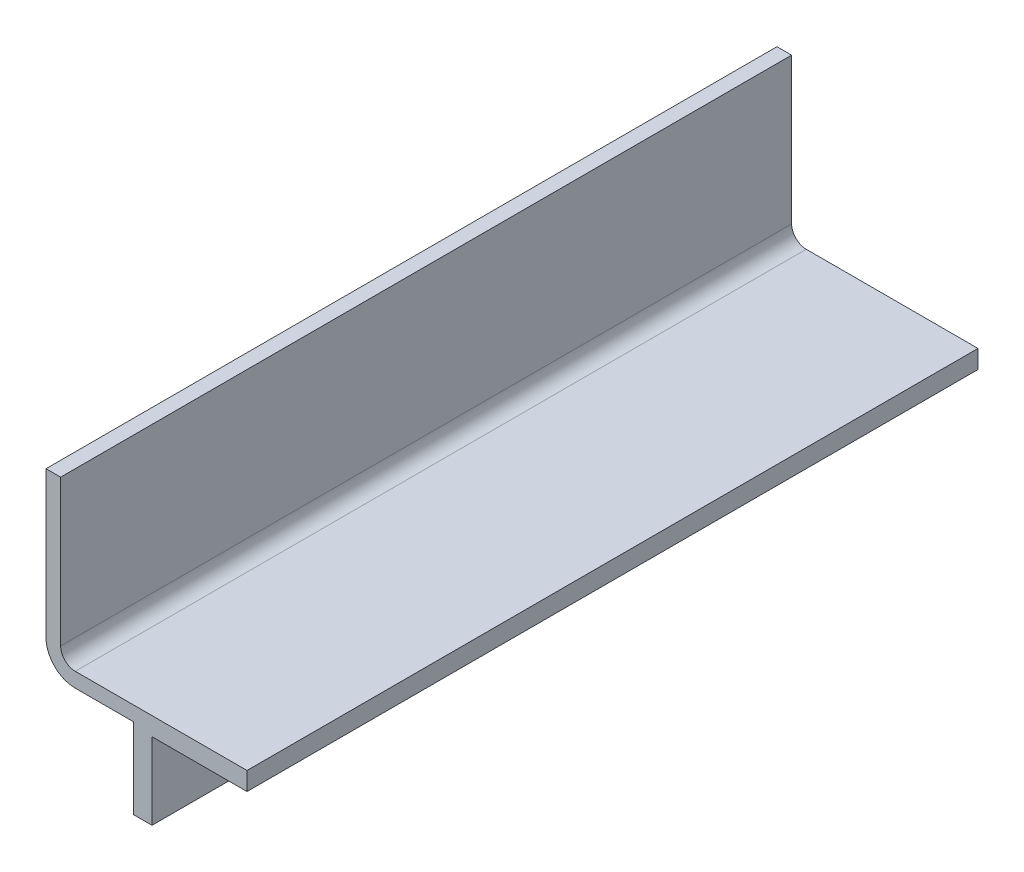
ISO-10303-21;
HEADER;
FILE_DESCRIPTION(('STEP AP214'),'2;1');
FILE_NAME('part.step','',(''),(''),'','','');
FILE_SCHEMA(('AUTOMOTIVE_DESIGN { 1 0 10303 214 1 1 1 1 }'));
ENDSEC;
DATA;
#1=APPLICATION_CONTEXT('core data for automotive mechanical design processes');
#2=APPLICATION_PROTOCOL_DEFINITION('international standard','automotive_design',2000,#1);
#3=PRODUCT_CONTEXT('',#1,'mechanical');
#4=PRODUCT('Part','Part','',(#3));
#5=PRODUCT_RELATED_PRODUCT_CATEGORY('part','',(#4));
#6=PRODUCT_DEFINITION_FORMATION('','',#4);
#7=PRODUCT_DEFINITION_CONTEXT('part definition',#1,'design');
#8=PRODUCT_DEFINITION('design','',#6,#7);
#9=PRODUCT_DEFINITION_SHAPE('','',#8);
#10=(LENGTH_UNIT() NAMED_UNIT(*) SI_UNIT(.MILLI.,.METRE.));
#11=(NAMED_UNIT(*) PLANE_ANGLE_UNIT() SI_UNIT($,.RADIAN.));
#12=(NAMED_UNIT(*) SI_UNIT($,.STERADIAN.) SOLID_ANGLE_UNIT());
#13=UNCERTAINTY_MEASURE_WITH_UNIT(LENGTH_MEASURE(1.E-05),#10,'distance_accuracy_value','');
#14=(GEOMETRIC_REPRESENTATION_CONTEXT(3) GLOBAL_UNCERTAINTY_ASSIGNED_CONTEXT((#13)) GLOBAL_UNIT_ASSIGNED_CONTEXT((#10,
#11,#12)) REPRESENTATION_CONTEXT('',''));
#15=CARTESIAN_POINT('',(0.,0.,0.));
#16=DIRECTION('',(0.,0.,1.));
#17=DIRECTION('',(1.,0.,0.));
#18=AXIS2_PLACEMENT_3D('',#15,#16,#17);
#19=CARTESIAN_POINT('',(-2.5,11.,100.));
#20=DIRECTION('',(1.,0.,0.));
#21=DIRECTION('',(0.,1.,0.));
#22=AXIS2_PLACEMENT_3D('',#19,#20,#21);
#23=PLANE('',#22);
#24=CARTESIAN_POINT('',(-2.5,4.5,15.));
#25=DIRECTION('',(-1.,0.,0.));
#26=DIRECTION('',(0.,0.,1.));
#27=AXIS2_PLACEMENT_3D('',#24,#25,#26);
#28=CIRCLE('',#27,2.24999999999999);
#29=CARTESIAN_POINT('',(-2.5,4.5,17.25));
#30=VERTEX_POINT('',#29);
#31=EDGE_CURVE('E265',#30,#30,#28,.T.);
#32=ORIENTED_EDGE('',*,*,#31,.F.);
#33=EDGE_LOOP('',(#32));
#34=FACE_BOUND('',#33,.T.);
#35=CARTESIAN_POINT('',(-2.5,4.5,85.));
#36=DIRECTION('',(-1.,0.,0.));
#37=DIRECTION('',(0.,0.,1.));
#38=AXIS2_PLACEMENT_3D('',#35,#36,#37);
#39=CIRCLE('',#38,2.24999999999999);
#40=CARTESIAN_POINT('',(-2.5,4.5,87.25));
#41=VERTEX_POINT('',#40);
#42=EDGE_CURVE('E268',#41,#41,#39,.T.);
#43=ORIENTED_EDGE('',*,*,#42,.F.);
#44=EDGE_LOOP('',(#43));
#45=FACE_BOUND('',#44,.T.);
#46=DIRECTION('',(0.,-1.,0.));
#47=VECTOR('',#46,1.);
#48=CARTESIAN_POINT('',(-2.5,11.,0.));
#49=LINE('',#48,#47);
#50=CARTESIAN_POINT('',(-2.5,11.,0.));
#51=VERTEX_POINT('',#50);
#52=CARTESIAN_POINT('',(-2.5,0.,0.));
#53=VERTEX_POINT('',#52);
#54=EDGE_CURVE('E156',#51,#53,#49,.T.);
#55=ORIENTED_EDGE('',*,*,#54,.T.);
#56=DIRECTION('',(0.,0.,-1.));
#57=VECTOR('',#56,1.);
#58=CARTESIAN_POINT('',(-2.5,0.,100.));
#59=LINE('',#58,#57);
#60=CARTESIAN_POINT('',(-2.5,0.,100.));
#61=VERTEX_POINT('',#60);
#62=EDGE_CURVE('E11',#61,#53,#59,.T.);
#63=ORIENTED_EDGE('',*,*,#62,.F.);
#64=DIRECTION('',(0.,-1.,0.));
#65=VECTOR('',#64,1.);
#66=CARTESIAN_POINT('',(-2.5,11.,100.));
#67=LINE('',#66,#65);
#68=CARTESIAN_POINT('',(-2.5,11.,100.));
#69=VERTEX_POINT('',#68);
#70=EDGE_CURVE('E179',#69,#61,#67,.T.);
#71=ORIENTED_EDGE('',*,*,#70,.F.);
#72=DIRECTION('',(0.,0.,-1.));
#73=VECTOR('',#72,1.);
#74=CARTESIAN_POINT('',(-2.5,11.,100.));
#75=LINE('',#74,#73);
#76=EDGE_CURVE('E152',#69,#51,#75,.T.);
#77=ORIENTED_EDGE('',*,*,#76,.T.);
#78=EDGE_LOOP('',(#55,#63,#71,#77));
#79=FACE_BOUND('',#78,.T.);
#80=ADVANCED_FACE('F36',(#34,#45,#79),#23,.F.);
#81=CARTESIAN_POINT('',(-2.5,0.,100.));
#82=DIRECTION('',(0.,1.,0.));
#83=DIRECTION('',(0.,0.,1.));
#84=AXIS2_PLACEMENT_3D('',#81,#82,#83);
#85=PLANE('',#84);
#86=DIRECTION('',(1.,0.,0.));
#87=VECTOR('',#86,1.);
#88=CARTESIAN_POINT('',(-2.5,0.,0.));
#89=LINE('',#88,#87);
#90=CARTESIAN_POINT('',(0.,0.,0.));
#91=VERTEX_POINT('',#90);
#92=EDGE_CURVE('E159',#53,#91,#89,.T.);
#93=ORIENTED_EDGE('',*,*,#92,.T.);
#94=DIRECTION('',(0.,0.,-1.));
#95=VECTOR('',#94,1.);
#96=CARTESIAN_POINT('',(0.,0.,100.));
#97=LINE('',#96,#95);
#98=CARTESIAN_POINT('',(0.,0.,100.));
#99=VERTEX_POINT('',#98);
#100=EDGE_CURVE('E44',#99,#91,#97,.T.);
#101=ORIENTED_EDGE('',*,*,#100,.F.);
#102=DIRECTION('',(1.,0.,0.));
#103=VECTOR('',#102,1.);
#104=CARTESIAN_POINT('',(-2.5,0.,100.));
#105=LINE('',#104,#103);
#106=EDGE_CURVE('E107',#61,#99,#105,.T.);
#107=ORIENTED_EDGE('',*,*,#106,.F.);
#108=ORIENTED_EDGE('',*,*,#62,.T.);
#109=EDGE_LOOP('',(#93,#101,#107,#108));
#110=FACE_BOUND('',#109,.T.);
#111=ADVANCED_FACE('F257',(#110),#85,.F.);
#112=CARTESIAN_POINT('',(0.,0.,100.));
#113=DIRECTION('',(-1.,0.,0.));
#114=DIRECTION('',(0.,0.,1.));
#115=AXIS2_PLACEMENT_3D('',#112,#113,#114);
#116=PLANE('',#115);
#117=CARTESIAN_POINT('',(0.,4.5,15.));
#118=DIRECTION('',(-1.,0.,0.));
#119=DIRECTION('',(0.,0.,1.));
#120=AXIS2_PLACEMENT_3D('',#117,#118,#119);
#121=CIRCLE('',#120,2.24999999999999);
#122=CARTESIAN_POINT('',(0.,4.5,17.25));
#123=VERTEX_POINT('',#122);
#124=EDGE_CURVE('E270',#123,#123,#121,.T.);
#125=ORIENTED_EDGE('',*,*,#124,.T.);
#126=EDGE_LOOP('',(#125));
#127=FACE_BOUND('',#126,.T.);
#128=CARTESIAN_POINT('',(0.,4.5,85.));
#129=DIRECTION('',(-1.,0.,0.));
#130=DIRECTION('',(0.,0.,1.));
#131=AXIS2_PLACEMENT_3D('',#128,#129,#130);
#132=CIRCLE('',#131,2.24999999999999);
#133=CARTESIAN_POINT('',(0.,4.5,87.25));
#134=VERTEX_POINT('',#133);
#135=EDGE_CURVE('E160',#134,#134,#132,.T.);
#136=ORIENTED_EDGE('',*,*,#135,.T.);
#137=EDGE_LOOP('',(#136));
#138=FACE_BOUND('',#137,.T.);
#139=DIRECTION('',(0.,1.,0.));
#140=VECTOR('',#139,1.);
#141=CARTESIAN_POINT('',(0.,0.,0.));
#142=LINE('',#141,#140);
#143=CARTESIAN_POINT('',(0.,10.5,0.));
#144=VERTEX_POINT('',#143);
#145=EDGE_CURVE('E162',#91,#144,#142,.T.);
#146=ORIENTED_EDGE('',*,*,#145,.T.);
#147=DIRECTION('',(0.,0.,-1.));
#148=VECTOR('',#147,1.);
#149=CARTESIAN_POINT('',(0.,10.5,100.));
#150=LINE('',#149,#148);
#151=CARTESIAN_POINT('',(0.,10.5,100.));
#152=VERTEX_POINT('',#151);
#153=EDGE_CURVE('E198',#152,#144,#150,.T.);
#154=ORIENTED_EDGE('',*,*,#153,.F.);
#155=DIRECTION('',(0.,1.,0.));
#156=VECTOR('',#155,1.);
#157=CARTESIAN_POINT('',(0.,0.,100.));
#158=LINE('',#157,#156);
#159=EDGE_CURVE('E206',#99,#152,#158,.T.);
#160=ORIENTED_EDGE('',*,*,#159,.F.);
#161=ORIENTED_EDGE('',*,*,#100,.T.);
#162=EDGE_LOOP('',(#146,#154,#160,#161));
#163=FACE_BOUND('',#162,.T.);
#164=ADVANCED_FACE('F204',(#127,#138,#163),#116,.F.);
#165=CARTESIAN_POINT('',(0.,10.5,100.));
#166=DIRECTION('',(0.,1.,0.));
#167=DIRECTION('',(0.,0.,1.));
#168=AXIS2_PLACEMENT_3D('',#165,#166,#167);
#169=PLANE('',#168);
#170=DIRECTION('',(1.,0.,0.));
#171=VECTOR('',#170,1.);
#172=CARTESIAN_POINT('',(0.,10.5,0.));
#173=LINE('',#172,#171);
#174=CARTESIAN_POINT('',(13.,10.5,0.));
#175=VERTEX_POINT('',#174);
#176=EDGE_CURVE('E164',#144,#175,#173,.T.);
#177=ORIENTED_EDGE('',*,*,#176,.T.);
#178=DIRECTION('',(0.,0.,-1.));
#179=VECTOR('',#178,1.);
#180=CARTESIAN_POINT('',(13.,10.5,100.));
#181=LINE('',#180,#179);
#182=CARTESIAN_POINT('',(13.,10.5,100.));
#183=VERTEX_POINT('',#182);
#184=EDGE_CURVE('E195',#183,#175,#181,.T.);
#185=ORIENTED_EDGE('',*,*,#184,.F.);
#186=DIRECTION('',(1.,0.,0.));
#187=VECTOR('',#186,1.);
#188=CARTESIAN_POINT('',(0.,10.5,100.));
#189=LINE('',#188,#187);
#190=EDGE_CURVE('E224',#152,#183,#189,.T.);
#191=ORIENTED_EDGE('',*,*,#190,.F.);
#192=ORIENTED_EDGE('',*,*,#153,.T.);
#193=EDGE_LOOP('',(#177,#185,#191,#192));
#194=FACE_BOUND('',#193,.T.);
#195=ADVANCED_FACE('F215',(#194),#169,.F.);
#196=CARTESIAN_POINT('',(13.,10.5,100.));
#197=DIRECTION('',(-1.,0.,0.));
#198=DIRECTION('',(0.,0.,1.));
#199=AXIS2_PLACEMENT_3D('',#196,#197,#198);
#200=PLANE('',#199);
#201=DIRECTION('',(0.,1.,0.));
#202=VECTOR('',#201,1.);
#203=CARTESIAN_POINT('',(13.,10.5,0.));
#204=LINE('',#203,#202);
#205=CARTESIAN_POINT('',(13.,13.,0.));
#206=VERTEX_POINT('',#205);
#207=EDGE_CURVE('E166',#175,#206,#204,.T.);
#208=ORIENTED_EDGE('',*,*,#207,.T.);
#209=DIRECTION('',(0.,0.,-1.));
#210=VECTOR('',#209,1.);
#211=CARTESIAN_POINT('',(13.,13.,100.));
#212=LINE('',#211,#210);
#213=CARTESIAN_POINT('',(13.,13.,100.));
#214=VERTEX_POINT('',#213);
#215=EDGE_CURVE('E192',#214,#206,#212,.T.);
#216=ORIENTED_EDGE('',*,*,#215,.F.);
#217=DIRECTION('',(0.,1.,0.));
#218=VECTOR('',#217,1.);
#219=CARTESIAN_POINT('',(13.,10.5,100.));
#220=LINE('',#219,#218);
#221=EDGE_CURVE('E221',#183,#214,#220,.T.);
#222=ORIENTED_EDGE('',*,*,#221,.F.);
#223=ORIENTED_EDGE('',*,*,#184,.T.);
#224=EDGE_LOOP('',(#208,#216,#222,#223));
#225=FACE_BOUND('',#224,.T.);
#226=ADVANCED_FACE('F219',(#225),#200,.F.);
#227=CARTESIAN_POINT('',(13.,13.,100.));
#228=DIRECTION('',(0.,-1.,0.));
#229=DIRECTION('',(1.,0.,0.));
#230=AXIS2_PLACEMENT_3D('',#227,#228,#229);
#231=PLANE('',#230);
#232=DIRECTION('',(-1.,0.,0.));
#233=VECTOR('',#232,1.);
#234=CARTESIAN_POINT('',(13.,13.,0.));
#235=LINE('',#234,#233);
#236=CARTESIAN_POINT('',(-10.5,13.,0.));
#237=VERTEX_POINT('',#236);
#238=EDGE_CURVE('E168',#206,#237,#235,.T.);
#239=ORIENTED_EDGE('',*,*,#238,.T.);
#240=DIRECTION('',(0.,0.,-1.));
#241=VECTOR('',#240,1.);
#242=CARTESIAN_POINT('',(-10.5,13.,100.));
#243=LINE('',#242,#241);
#244=CARTESIAN_POINT('',(-10.5,13.,100.));
#245=VERTEX_POINT('',#244);
#246=EDGE_CURVE('E189',#245,#237,#243,.T.);
#247=ORIENTED_EDGE('',*,*,#246,.F.);
#248=DIRECTION('',(-1.,0.,0.));
#249=VECTOR('',#248,1.);
#250=CARTESIAN_POINT('',(13.,13.,100.));
#251=LINE('',#250,#249);
#252=EDGE_CURVE('E223',#214,#245,#251,.T.);
#253=ORIENTED_EDGE('',*,*,#252,.F.);
#254=ORIENTED_EDGE('',*,*,#215,.T.);
#255=EDGE_LOOP('',(#239,#247,#253,#254));
#256=FACE_BOUND('',#255,.T.);
#257=ADVANCED_FACE('F353',(#256),#231,.F.);
#258=CARTESIAN_POINT('',(-10.5,15.,100.));
#259=DIRECTION('',(0.,0.,-1.));
#260=DIRECTION('',(-1.,0.,0.));
#261=AXIS2_PLACEMENT_3D('',#258,#259,#260);
#262=CYLINDRICAL_SURFACE('',#261,2.);
#263=CARTESIAN_POINT('',(-10.5,15.,0.));
#264=DIRECTION('',(0.,0.,-1.));
#265=DIRECTION('',(1.,0.,0.));
#266=AXIS2_PLACEMENT_3D('',#263,#264,#265);
#267=CIRCLE('',#266,2.);
#268=CARTESIAN_POINT('',(-12.5,15.,0.));
#269=VERTEX_POINT('',#268);
#270=EDGE_CURVE('E170',#237,#269,#267,.T.);
#271=ORIENTED_EDGE('',*,*,#270,.T.);
#272=DIRECTION('',(0.,0.,-1.));
#273=VECTOR('',#272,1.);
#274=CARTESIAN_POINT('',(-12.5,15.,100.));
#275=LINE('',#274,#273);
#276=CARTESIAN_POINT('',(-12.5,15.,100.));
#277=VERTEX_POINT('',#276);
#278=EDGE_CURVE('E186',#277,#269,#275,.T.);
#279=ORIENTED_EDGE('',*,*,#278,.F.);
#280=CARTESIAN_POINT('',(-10.5,15.,100.));
#281=DIRECTION('',(0.,0.,-1.));
#282=DIRECTION('',(1.,0.,0.));
#283=AXIS2_PLACEMENT_3D('',#280,#281,#282);
#284=CIRCLE('',#283,2.);
#285=EDGE_CURVE('E226',#245,#277,#284,.T.);
#286=ORIENTED_EDGE('',*,*,#285,.F.);
#287=ORIENTED_EDGE('',*,*,#246,.T.);
#288=EDGE_LOOP('',(#271,#279,#286,#287));
#289=FACE_BOUND('',#288,.T.);
#290=ADVANCED_FACE('F343',(#289),#262,.F.);
#291=CARTESIAN_POINT('',(-12.5,15.,100.));
#292=DIRECTION('',(-1.,0.,0.));
#293=DIRECTION('',(0.,-1.,0.));
#294=AXIS2_PLACEMENT_3D('',#291,#292,#293);
#295=PLANE('',#294);
#296=DIRECTION('',(0.,1.,0.));
#297=VECTOR('',#296,1.);
#298=CARTESIAN_POINT('',(-12.5,15.,0.));
#299=LINE('',#298,#297);
#300=CARTESIAN_POINT('',(-12.5,35.,0.));
#301=VERTEX_POINT('',#300);
#302=EDGE_CURVE('E172',#269,#301,#299,.T.);
#303=ORIENTED_EDGE('',*,*,#302,.T.);
#304=DIRECTION('',(0.,0.,-1.));
#305=VECTOR('',#304,1.);
#306=CARTESIAN_POINT('',(-12.5,35.,100.));
#307=LINE('',#306,#305);
#308=CARTESIAN_POINT('',(-12.5,35.,100.));
#309=VERTEX_POINT('',#308);
#310=EDGE_CURVE('E183',#309,#301,#307,.T.);
#311=ORIENTED_EDGE('',*,*,#310,.F.);
#312=DIRECTION('',(0.,1.,0.));
#313=VECTOR('',#312,1.);
#314=CARTESIAN_POINT('',(-12.5,15.,100.));
#315=LINE('',#314,#313);
#316=EDGE_CURVE('E232',#277,#309,#315,.T.);
#317=ORIENTED_EDGE('',*,*,#316,.F.);
#318=ORIENTED_EDGE('',*,*,#278,.T.);
#319=EDGE_LOOP('',(#303,#311,#317,#318));
#320=FACE_BOUND('',#319,.T.);
#321=ADVANCED_FACE('F238',(#320),#295,.F.);
#322=CARTESIAN_POINT('',(-12.5,35.,100.));
#323=DIRECTION('',(0.,-1.,0.));
#324=DIRECTION('',(0.,0.,-1.));
#325=AXIS2_PLACEMENT_3D('',#322,#323,#324);
#326=PLANE('',#325);
#327=DIRECTION('',(-1.,0.,0.));
#328=VECTOR('',#327,1.);
#329=CARTESIAN_POINT('',(-12.5,35.,0.));
#330=LINE('',#329,#328);
#331=CARTESIAN_POINT('',(-14.5,35.,0.));
#332=VERTEX_POINT('',#331);
#333=EDGE_CURVE('E174',#301,#332,#330,.T.);
#334=ORIENTED_EDGE('',*,*,#333,.T.);
#335=DIRECTION('',(0.,0.,-1.));
#336=VECTOR('',#335,1.);
#337=CARTESIAN_POINT('',(-14.5,35.,100.));
#338=LINE('',#337,#336);
#339=CARTESIAN_POINT('',(-14.5,35.,100.));
#340=VERTEX_POINT('',#339);
#341=EDGE_CURVE('E147',#340,#332,#338,.T.);
#342=ORIENTED_EDGE('',*,*,#341,.F.);
#343=DIRECTION('',(-1.,0.,0.));
#344=VECTOR('',#343,1.);
#345=CARTESIAN_POINT('',(-12.5,35.,100.));
#346=LINE('',#345,#344);
#347=EDGE_CURVE('E138',#309,#340,#346,.T.);
#348=ORIENTED_EDGE('',*,*,#347,.F.);
#349=ORIENTED_EDGE('',*,*,#310,.T.);
#350=EDGE_LOOP('',(#334,#342,#348,#349));
#351=FACE_BOUND('',#350,.T.);
#352=ADVANCED_FACE('F242',(#351),#326,.F.);
#353=CARTESIAN_POINT('',(-14.5,35.,100.));
#354=DIRECTION('',(1.,0.,0.));
#355=DIRECTION('',(0.,1.,0.));
#356=AXIS2_PLACEMENT_3D('',#353,#354,#355);
#357=PLANE('',#356);
#358=DIRECTION('',(0.,-1.,0.));
#359=VECTOR('',#358,1.);
#360=CARTESIAN_POINT('',(-14.5,35.,0.));
#361=LINE('',#360,#359);
#362=CARTESIAN_POINT('',(-14.5,15.,0.));
#363=VERTEX_POINT('',#362);
#364=EDGE_CURVE('E146',#332,#363,#361,.T.);
#365=ORIENTED_EDGE('',*,*,#364,.T.);
#366=DIRECTION('',(0.,0.,-1.));
#367=VECTOR('',#366,1.);
#368=CARTESIAN_POINT('',(-14.5,15.,100.));
#369=LINE('',#368,#367);
#370=CARTESIAN_POINT('',(-14.5,15.,100.));
#371=VERTEX_POINT('',#370);
#372=EDGE_CURVE('E143',#371,#363,#369,.T.);
#373=ORIENTED_EDGE('',*,*,#372,.F.);
#374=DIRECTION('',(0.,-1.,0.));
#375=VECTOR('',#374,1.);
#376=CARTESIAN_POINT('',(-14.5,35.,100.));
#377=LINE('',#376,#375);
#378=EDGE_CURVE('E132',#340,#371,#377,.T.);
#379=ORIENTED_EDGE('',*,*,#378,.F.);
#380=ORIENTED_EDGE('',*,*,#341,.T.);
#381=EDGE_LOOP('',(#365,#373,#379,#380));
#382=FACE_BOUND('',#381,.T.);
#383=ADVANCED_FACE('F144',(#382),#357,.F.);
#384=CARTESIAN_POINT('',(-10.5,15.,100.));
#385=DIRECTION('',(0.,0.,-1.));
#386=DIRECTION('',(-1.,0.,0.));
#387=AXIS2_PLACEMENT_3D('',#384,#385,#386);
#388=CYLINDRICAL_SURFACE('',#387,4.);
#389=CARTESIAN_POINT('',(-10.5,15.,0.));
#390=DIRECTION('',(0.,0.,1.));
#391=DIRECTION('',(-1.,0.,0.));
#392=AXIS2_PLACEMENT_3D('',#389,#390,#391);
#393=CIRCLE('',#392,4.);
#394=CARTESIAN_POINT('',(-10.5,11.,0.));
#395=VERTEX_POINT('',#394);
#396=EDGE_CURVE('E93',#363,#395,#393,.T.);
#397=ORIENTED_EDGE('',*,*,#396,.T.);
#398=DIRECTION('',(0.,0.,-1.));
#399=VECTOR('',#398,1.);
#400=CARTESIAN_POINT('',(-10.5,11.,100.));
#401=LINE('',#400,#399);
#402=CARTESIAN_POINT('',(-10.5,11.,100.));
#403=VERTEX_POINT('',#402);
#404=EDGE_CURVE('E148',#403,#395,#401,.T.);
#405=ORIENTED_EDGE('',*,*,#404,.F.);
#406=CARTESIAN_POINT('',(-10.5,15.,100.));
#407=DIRECTION('',(0.,0.,1.));
#408=DIRECTION('',(-1.,0.,0.));
#409=AXIS2_PLACEMENT_3D('',#406,#407,#408);
#410=CIRCLE('',#409,4.);
#411=EDGE_CURVE('E136',#371,#403,#410,.T.);
#412=ORIENTED_EDGE('',*,*,#411,.F.);
#413=ORIENTED_EDGE('',*,*,#372,.T.);
#414=EDGE_LOOP('',(#397,#405,#412,#413));
#415=FACE_BOUND('',#414,.T.);
#416=ADVANCED_FACE('F150',(#415),#388,.T.);
#417=CARTESIAN_POINT('',(-10.5,11.,100.));
#418=DIRECTION('',(0.,1.,0.));
#419=DIRECTION('',(0.,0.,1.));
#420=AXIS2_PLACEMENT_3D('',#417,#418,#419);
#421=PLANE('',#420);
#422=DIRECTION('',(1.,0.,0.));
#423=VECTOR('',#422,1.);
#424=CARTESIAN_POINT('',(-10.5,11.,0.));
#425=LINE('',#424,#423);
#426=EDGE_CURVE('E99',#395,#51,#425,.T.);
#427=ORIENTED_EDGE('',*,*,#426,.T.);
#428=ORIENTED_EDGE('',*,*,#76,.F.);
#429=DIRECTION('',(1.,0.,0.));
#430=VECTOR('',#429,1.);
#431=CARTESIAN_POINT('',(-10.5,11.,100.));
#432=LINE('',#431,#430);
#433=EDGE_CURVE('E52',#403,#69,#432,.T.);
#434=ORIENTED_EDGE('',*,*,#433,.F.);
#435=ORIENTED_EDGE('',*,*,#404,.T.);
#436=EDGE_LOOP('',(#427,#428,#434,#435));
#437=FACE_BOUND('',#436,.T.);
#438=ADVANCED_FACE('F246',(#437),#421,.F.);
#439=CARTESIAN_POINT('',(-10.5,15.,100.));
#440=DIRECTION('',(0.,0.,1.));
#441=DIRECTION('',(1.,0.,0.));
#442=AXIS2_PLACEMENT_3D('',#439,#440,#441);
#443=PLANE('',#442);
#444=ORIENTED_EDGE('',*,*,#70,.T.);
#445=ORIENTED_EDGE('',*,*,#106,.T.);
#446=ORIENTED_EDGE('',*,*,#159,.T.);
#447=ORIENTED_EDGE('',*,*,#190,.T.);
#448=ORIENTED_EDGE('',*,*,#221,.T.);
#449=ORIENTED_EDGE('',*,*,#252,.T.);
#450=ORIENTED_EDGE('',*,*,#285,.T.);
#451=ORIENTED_EDGE('',*,*,#316,.T.);
#452=ORIENTED_EDGE('',*,*,#347,.T.);
#453=ORIENTED_EDGE('',*,*,#378,.T.);
#454=ORIENTED_EDGE('',*,*,#411,.T.);
#455=ORIENTED_EDGE('',*,*,#433,.T.);
#456=EDGE_LOOP('',(#444,#445,#446,#447,#448,#449,#450,#451,#452,#453,#454,#455));
#457=FACE_BOUND('',#456,.T.);
#458=ADVANCED_FACE('F134',(#457),#443,.T.);
#459=CARTESIAN_POINT('',(-10.5,15.,0.));
#460=DIRECTION('',(0.,0.,1.));
#461=DIRECTION('',(1.,0.,0.));
#462=AXIS2_PLACEMENT_3D('',#459,#460,#461);
#463=PLANE('',#462);
#464=ORIENTED_EDGE('',*,*,#54,.F.);
#465=ORIENTED_EDGE('',*,*,#426,.F.);
#466=ORIENTED_EDGE('',*,*,#396,.F.);
#467=ORIENTED_EDGE('',*,*,#364,.F.);
#468=ORIENTED_EDGE('',*,*,#333,.F.);
#469=ORIENTED_EDGE('',*,*,#302,.F.);
#470=ORIENTED_EDGE('',*,*,#270,.F.);
#471=ORIENTED_EDGE('',*,*,#238,.F.);
#472=ORIENTED_EDGE('',*,*,#207,.F.);
#473=ORIENTED_EDGE('',*,*,#176,.F.);
#474=ORIENTED_EDGE('',*,*,#145,.F.);
#475=ORIENTED_EDGE('',*,*,#92,.F.);
#476=EDGE_LOOP('',(#464,#465,#466,#467,#468,#469,#470,#471,#472,#473,#474,#475));
#477=FACE_BOUND('',#476,.T.);
#478=ADVANCED_FACE('F210',(#477),#463,.F.);
#479=CARTESIAN_POINT('',(-2.5,4.5,85.));
#480=DIRECTION('',(-1.,0.,0.));
#481=DIRECTION('',(0.,0.,1.));
#482=AXIS2_PLACEMENT_3D('',#479,#480,#481);
#483=CYLINDRICAL_SURFACE('',#482,2.24999999999999);
#484=ORIENTED_EDGE('',*,*,#42,.T.);
#485=EDGE_LOOP('',(#484));
#486=FACE_BOUND('',#485,.T.);
#487=ORIENTED_EDGE('',*,*,#135,.F.);
#488=EDGE_LOOP('',(#487));
#489=FACE_BOUND('',#488,.T.);
#490=ADVANCED_FACE('F283',(#486,#489),#483,.F.);
#491=CARTESIAN_POINT('',(-2.5,4.5,15.));
#492=DIRECTION('',(-1.,0.,0.));
#493=DIRECTION('',(0.,0.,1.));
#494=AXIS2_PLACEMENT_3D('',#491,#492,#493);
#495=CYLINDRICAL_SURFACE('',#494,2.24999999999999);
#496=ORIENTED_EDGE('',*,*,#31,.T.);
#497=EDGE_LOOP('',(#496));
#498=FACE_BOUND('',#497,.T.);
#499=ORIENTED_EDGE('',*,*,#124,.F.);
#500=EDGE_LOOP('',(#499));
#501=FACE_BOUND('',#500,.T.);
#502=ADVANCED_FACE('F280',(#498,#501),#495,.F.);
#503=CLOSED_SHELL('',(#80,#111,#164,#195,#226,#257,#290,#321,#352,#383,#416,#438,#458,#478,#490,#502));
#504=MANIFOLD_SOLID_BREP('B2',#503);
#505=ADVANCED_BREP_SHAPE_REPRESENTATION('',(#18,#504),#14);
#506=SHAPE_DEFINITION_REPRESENTATION(#9,#505);
ENDSEC;
END-ISO-10303-21;
